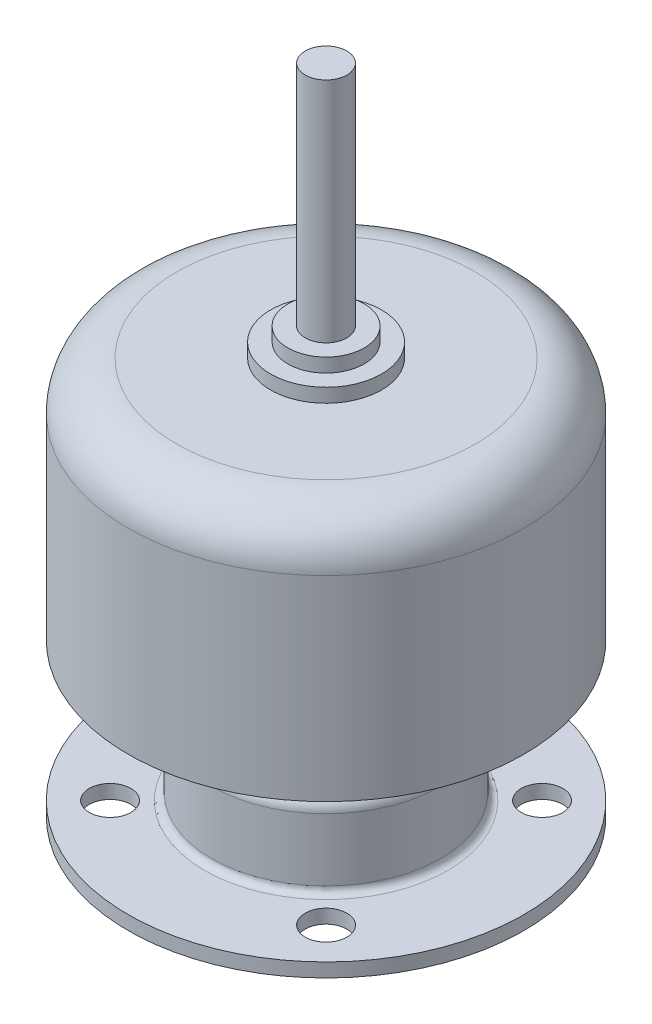
ISO-10303-21;
HEADER;
FILE_DESCRIPTION(('STEP AP214'),'2;1');
FILE_NAME('part.step','',(''),(''),'','','');
FILE_SCHEMA(('AUTOMOTIVE_DESIGN { 1 0 10303 214 1 1 1 1 }'));
ENDSEC;
DATA;
#1=APPLICATION_CONTEXT('core data for automotive mechanical design processes');
#2=APPLICATION_PROTOCOL_DEFINITION('international standard','automotive_design',2000,#1);
#3=PRODUCT_CONTEXT('',#1,'mechanical');
#4=PRODUCT('Part','Part','',(#3));
#5=PRODUCT_RELATED_PRODUCT_CATEGORY('part','',(#4));
#6=PRODUCT_DEFINITION_FORMATION('','',#4);
#7=PRODUCT_DEFINITION_CONTEXT('part definition',#1,'design');
#8=PRODUCT_DEFINITION('design','',#6,#7);
#9=PRODUCT_DEFINITION_SHAPE('','',#8);
#10=(LENGTH_UNIT() NAMED_UNIT(*) SI_UNIT(.MILLI.,.METRE.));
#11=(NAMED_UNIT(*) PLANE_ANGLE_UNIT() SI_UNIT($,.RADIAN.));
#12=(NAMED_UNIT(*) SI_UNIT($,.STERADIAN.) SOLID_ANGLE_UNIT());
#13=UNCERTAINTY_MEASURE_WITH_UNIT(LENGTH_MEASURE(1.E-05),#10,'distance_accuracy_value','');
#14=(GEOMETRIC_REPRESENTATION_CONTEXT(3) GLOBAL_UNCERTAINTY_ASSIGNED_CONTEXT((#13)) GLOBAL_UNIT_ASSIGNED_CONTEXT((#10,
#11,#12)) REPRESENTATION_CONTEXT('',''));
#15=CARTESIAN_POINT('',(0.,0.,0.));
#16=DIRECTION('',(0.,0.,1.));
#17=DIRECTION('',(1.,0.,0.));
#18=AXIS2_PLACEMENT_3D('',#15,#16,#17);
#19=CARTESIAN_POINT('',(0.,28.6,0.));
#20=DIRECTION('',(0.,-1.,0.));
#21=DIRECTION('',(0.,0.,-1.));
#22=AXIS2_PLACEMENT_3D('',#19,#20,#21);
#23=PLANE('',#22);
#24=CARTESIAN_POINT('',(0.,28.6,0.));
#25=DIRECTION('',(0.,-1.,0.));
#26=DIRECTION('',(0.,0.,-1.));
#27=AXIS2_PLACEMENT_3D('',#24,#25,#26);
#28=CIRCLE('',#27,10.75);
#29=CARTESIAN_POINT('',(0.,28.6,-10.75));
#30=VERTEX_POINT('',#29);
#31=EDGE_CURVE('E64',#30,#30,#28,.F.);
#32=ORIENTED_EDGE('',*,*,#31,.T.);
#33=EDGE_LOOP('',(#32));
#34=FACE_BOUND('',#33,.T.);
#35=CARTESIAN_POINT('',(0.,28.6,0.));
#36=DIRECTION('',(0.,-1.,0.));
#37=DIRECTION('',(0.,0.,-1.));
#38=AXIS2_PLACEMENT_3D('',#35,#36,#37);
#39=CIRCLE('',#38,4.);
#40=CARTESIAN_POINT('',(0.,28.6,-4.));
#41=VERTEX_POINT('',#40);
#42=EDGE_CURVE('E84',#41,#41,#39,.T.);
#43=ORIENTED_EDGE('',*,*,#42,.T.);
#44=EDGE_LOOP('',(#43));
#45=FACE_BOUND('',#44,.T.);
#46=ADVANCED_FACE('F44',(#34,#45),#23,.F.);
#47=CARTESIAN_POINT('',(0.,0.,0.));
#48=DIRECTION('',(0.,-1.,0.));
#49=DIRECTION('',(0.,0.,-1.));
#50=AXIS2_PLACEMENT_3D('',#47,#48,#49);
#51=CYLINDRICAL_SURFACE('',#50,4.);
#52=ORIENTED_EDGE('',*,*,#42,.F.);
#53=EDGE_LOOP('',(#52));
#54=FACE_BOUND('',#53,.T.);
#55=CARTESIAN_POINT('',(0.,29.6,0.));
#56=DIRECTION('',(0.,-1.,0.));
#57=DIRECTION('',(0.,0.,-1.));
#58=AXIS2_PLACEMENT_3D('',#55,#56,#57);
#59=CIRCLE('',#58,4.);
#60=CARTESIAN_POINT('',(0.,29.6,-4.));
#61=VERTEX_POINT('',#60);
#62=EDGE_CURVE('E87',#61,#61,#59,.T.);
#63=ORIENTED_EDGE('',*,*,#62,.T.);
#64=EDGE_LOOP('',(#63));
#65=FACE_BOUND('',#64,.T.);
#66=ADVANCED_FACE('F151',(#54,#65),#51,.T.);
#67=CARTESIAN_POINT('',(0.,29.6,0.));
#68=DIRECTION('',(0.,-1.,0.));
#69=DIRECTION('',(0.,0.,-1.));
#70=AXIS2_PLACEMENT_3D('',#67,#68,#69);
#71=PLANE('',#70);
#72=ORIENTED_EDGE('',*,*,#62,.F.);
#73=EDGE_LOOP('',(#72));
#74=FACE_BOUND('',#73,.T.);
#75=CARTESIAN_POINT('',(0.,29.6,0.));
#76=DIRECTION('',(0.,-1.,0.));
#77=DIRECTION('',(0.,0.,-1.));
#78=AXIS2_PLACEMENT_3D('',#75,#76,#77);
#79=CIRCLE('',#78,2.75);
#80=CARTESIAN_POINT('',(0.,29.6,-2.75));
#81=VERTEX_POINT('',#80);
#82=EDGE_CURVE('E90',#81,#81,#79,.T.);
#83=ORIENTED_EDGE('',*,*,#82,.T.);
#84=EDGE_LOOP('',(#83));
#85=FACE_BOUND('',#84,.T.);
#86=ADVANCED_FACE('F157',(#74,#85),#71,.F.);
#87=CARTESIAN_POINT('',(0.,0.,0.));
#88=DIRECTION('',(0.,-1.,0.));
#89=DIRECTION('',(0.,0.,-1.));
#90=AXIS2_PLACEMENT_3D('',#87,#88,#89);
#91=CYLINDRICAL_SURFACE('',#90,2.75);
#92=CARTESIAN_POINT('',(0.,30.6,0.));
#93=DIRECTION('',(0.,-1.,0.));
#94=DIRECTION('',(0.,0.,-1.));
#95=AXIS2_PLACEMENT_3D('',#92,#93,#94);
#96=CIRCLE('',#95,2.75);
#97=CARTESIAN_POINT('',(0.,30.6,-2.75));
#98=VERTEX_POINT('',#97);
#99=EDGE_CURVE('E93',#98,#98,#96,.T.);
#100=ORIENTED_EDGE('',*,*,#99,.T.);
#101=EDGE_LOOP('',(#100));
#102=FACE_BOUND('',#101,.T.);
#103=ORIENTED_EDGE('',*,*,#82,.F.);
#104=EDGE_LOOP('',(#103));
#105=FACE_BOUND('',#104,.T.);
#106=ADVANCED_FACE('F298',(#102,#105),#91,.T.);
#107=CARTESIAN_POINT('',(0.,30.6,0.));
#108=DIRECTION('',(0.,1.,0.));
#109=DIRECTION('',(0.,0.,1.));
#110=AXIS2_PLACEMENT_3D('',#107,#108,#109);
#111=PLANE('',#110);
#112=CARTESIAN_POINT('',(0.,30.6,0.));
#113=DIRECTION('',(0.,-1.,0.));
#114=DIRECTION('',(0.,0.,-1.));
#115=AXIS2_PLACEMENT_3D('',#112,#113,#114);
#116=CIRCLE('',#115,1.5);
#117=CARTESIAN_POINT('',(0.,30.6,-1.5));
#118=VERTEX_POINT('',#117);
#119=EDGE_CURVE('E96',#118,#118,#116,.T.);
#120=ORIENTED_EDGE('',*,*,#119,.T.);
#121=EDGE_LOOP('',(#120));
#122=FACE_BOUND('',#121,.T.);
#123=ORIENTED_EDGE('',*,*,#99,.F.);
#124=EDGE_LOOP('',(#123));
#125=FACE_BOUND('',#124,.T.);
#126=ADVANCED_FACE('F289',(#122,#125),#111,.T.);
#127=CARTESIAN_POINT('',(0.,0.,0.));
#128=DIRECTION('',(0.,-1.,0.));
#129=DIRECTION('',(0.,0.,-1.));
#130=AXIS2_PLACEMENT_3D('',#127,#128,#129);
#131=CYLINDRICAL_SURFACE('',#130,1.5);
#132=CARTESIAN_POINT('',(0.,47.,0.));
#133=DIRECTION('',(0.,-1.,0.));
#134=DIRECTION('',(0.,0.,-1.));
#135=AXIS2_PLACEMENT_3D('',#132,#133,#134);
#136=CIRCLE('',#135,1.5);
#137=CARTESIAN_POINT('',(0.,47.,-1.5));
#138=VERTEX_POINT('',#137);
#139=EDGE_CURVE('E99',#138,#138,#136,.T.);
#140=ORIENTED_EDGE('',*,*,#139,.T.);
#141=EDGE_LOOP('',(#140));
#142=FACE_BOUND('',#141,.T.);
#143=ORIENTED_EDGE('',*,*,#119,.F.);
#144=EDGE_LOOP('',(#143));
#145=FACE_BOUND('',#144,.T.);
#146=ADVANCED_FACE('F280',(#142,#145),#131,.T.);
#147=CARTESIAN_POINT('',(0.,47.,0.));
#148=DIRECTION('',(0.,1.,0.));
#149=DIRECTION('',(0.,0.,1.));
#150=AXIS2_PLACEMENT_3D('',#147,#148,#149);
#151=PLANE('',#150);
#152=ORIENTED_EDGE('',*,*,#139,.F.);
#153=EDGE_LOOP('',(#152));
#154=FACE_BOUND('',#153,.T.);
#155=ADVANCED_FACE('F134',(#154),#151,.T.);
#156=CARTESIAN_POINT('',(0.,0.,0.));
#157=DIRECTION('',(0.,-1.,0.));
#158=DIRECTION('',(0.,0.,-1.));
#159=AXIS2_PLACEMENT_3D('',#156,#157,#158);
#160=PLANE('',#159);
#161=CARTESIAN_POINT('',(7.77817459305201,0.,7.77817459305204));
#162=DIRECTION('',(0.,-1.,0.));
#163=DIRECTION('',(0.,0.,-1.));
#164=AXIS2_PLACEMENT_3D('',#161,#162,#163);
#165=CIRCLE('',#164,1.5);
#166=CARTESIAN_POINT('',(7.77817459305201,0.,6.27817459305204));
#167=VERTEX_POINT('',#166);
#168=EDGE_CURVE('E119',#167,#167,#165,.T.);
#169=ORIENTED_EDGE('',*,*,#168,.F.);
#170=EDGE_LOOP('',(#169));
#171=FACE_BOUND('',#170,.T.);
#172=CARTESIAN_POINT('',(-7.77817459305201,0.,-7.77817459305198));
#173=DIRECTION('',(0.,-1.,0.));
#174=DIRECTION('',(0.,0.,-1.));
#175=AXIS2_PLACEMENT_3D('',#172,#173,#174);
#176=CIRCLE('',#175,1.50000000000005);
#177=CARTESIAN_POINT('',(-7.77817459305201,0.,-9.27817459305203));
#178=VERTEX_POINT('',#177);
#179=EDGE_CURVE('E122',#178,#178,#176,.T.);
#180=ORIENTED_EDGE('',*,*,#179,.F.);
#181=EDGE_LOOP('',(#180));
#182=FACE_BOUND('',#181,.T.);
#183=CARTESIAN_POINT('',(-7.77817459305201,0.,7.77817459305203));
#184=DIRECTION('',(0.,-1.,0.));
#185=DIRECTION('',(0.,0.,-1.));
#186=AXIS2_PLACEMENT_3D('',#183,#184,#185);
#187=CIRCLE('',#186,1.50000000000004);
#188=CARTESIAN_POINT('',(-7.77817459305201,0.,6.278174593052));
#189=VERTEX_POINT('',#188);
#190=EDGE_CURVE('E118',#189,#189,#187,.T.);
#191=ORIENTED_EDGE('',*,*,#190,.F.);
#192=EDGE_LOOP('',(#191));
#193=FACE_BOUND('',#192,.T.);
#194=CARTESIAN_POINT('',(7.77817459305201,0.,-7.77817459305198));
#195=DIRECTION('',(0.,-1.,0.));
#196=DIRECTION('',(0.,0.,-1.));
#197=AXIS2_PLACEMENT_3D('',#194,#195,#196);
#198=CIRCLE('',#197,1.50000000000005);
#199=CARTESIAN_POINT('',(7.77817459305201,0.,-9.27817459305203));
#200=VERTEX_POINT('',#199);
#201=EDGE_CURVE('E78',#200,#200,#198,.T.);
#202=ORIENTED_EDGE('',*,*,#201,.F.);
#203=EDGE_LOOP('',(#202));
#204=FACE_BOUND('',#203,.T.);
#205=CARTESIAN_POINT('',(0.,0.,0.));
#206=DIRECTION('',(0.,-1.,0.));
#207=DIRECTION('',(0.,0.,-1.));
#208=AXIS2_PLACEMENT_3D('',#205,#206,#207);
#209=CIRCLE('',#208,14.25);
#210=CARTESIAN_POINT('',(0.,0.,-14.25));
#211=VERTEX_POINT('',#210);
#212=EDGE_CURVE('E102',#211,#211,#209,.T.);
#213=ORIENTED_EDGE('',*,*,#212,.T.);
#214=EDGE_LOOP('',(#213));
#215=FACE_BOUND('',#214,.T.);
#216=ADVANCED_FACE('F130',(#171,#182,#193,#204,#215),#160,.T.);
#217=CARTESIAN_POINT('',(0.,0.,0.));
#218=DIRECTION('',(0.,-1.,0.));
#219=DIRECTION('',(0.,0.,-1.));
#220=AXIS2_PLACEMENT_3D('',#217,#218,#219);
#221=CYLINDRICAL_SURFACE('',#220,14.25);
#222=CARTESIAN_POINT('',(0.,1.,0.));
#223=DIRECTION('',(0.,-1.,0.));
#224=DIRECTION('',(0.,0.,-1.));
#225=AXIS2_PLACEMENT_3D('',#222,#223,#224);
#226=CIRCLE('',#225,14.25);
#227=CARTESIAN_POINT('',(0.,1.,-14.25));
#228=VERTEX_POINT('',#227);
#229=EDGE_CURVE('E105',#228,#228,#226,.T.);
#230=ORIENTED_EDGE('',*,*,#229,.T.);
#231=EDGE_LOOP('',(#230));
#232=FACE_BOUND('',#231,.T.);
#233=ORIENTED_EDGE('',*,*,#212,.F.);
#234=EDGE_LOOP('',(#233));
#235=FACE_BOUND('',#234,.T.);
#236=ADVANCED_FACE('F133',(#232,#235),#221,.T.);
#237=CARTESIAN_POINT('',(0.,1.,0.));
#238=DIRECTION('',(0.,1.,0.));
#239=DIRECTION('',(0.,0.,1.));
#240=AXIS2_PLACEMENT_3D('',#237,#238,#239);
#241=PLANE('',#240);
#242=CARTESIAN_POINT('',(0.,1.,0.));
#243=DIRECTION('',(0.,1.,0.));
#244=DIRECTION('',(0.,0.,1.));
#245=AXIS2_PLACEMENT_3D('',#242,#243,#244);
#246=CIRCLE('',#245,8.75);
#247=CARTESIAN_POINT('',(0.,1.,8.75));
#248=VERTEX_POINT('',#247);
#249=EDGE_CURVE('E51',#248,#248,#246,.F.);
#250=ORIENTED_EDGE('',*,*,#249,.T.);
#251=EDGE_LOOP('',(#250));
#252=FACE_BOUND('',#251,.T.);
#253=CARTESIAN_POINT('',(7.77817459305201,0.999999999999999,7.77817459305204));
#254=DIRECTION('',(0.,1.,0.));
#255=DIRECTION('',(0.,0.,1.));
#256=AXIS2_PLACEMENT_3D('',#253,#254,#255);
#257=CIRCLE('',#256,1.5);
#258=CARTESIAN_POINT('',(7.77817459305201,0.999999999999999,9.27817459305203));
#259=VERTEX_POINT('',#258);
#260=EDGE_CURVE('E65',#259,#259,#257,.T.);
#261=ORIENTED_EDGE('',*,*,#260,.F.);
#262=EDGE_LOOP('',(#261));
#263=FACE_BOUND('',#262,.T.);
#264=CARTESIAN_POINT('',(-7.77817459305201,0.999999999999999,-7.77817459305198));
#265=DIRECTION('',(0.,1.,0.));
#266=DIRECTION('',(0.,0.,1.));
#267=AXIS2_PLACEMENT_3D('',#264,#265,#266);
#268=CIRCLE('',#267,1.50000000000005);
#269=CARTESIAN_POINT('',(-7.77817459305201,0.999999999999999,-6.27817459305193));
#270=VERTEX_POINT('',#269);
#271=EDGE_CURVE('E69',#270,#270,#268,.T.);
#272=ORIENTED_EDGE('',*,*,#271,.F.);
#273=EDGE_LOOP('',(#272));
#274=FACE_BOUND('',#273,.T.);
#275=CARTESIAN_POINT('',(-7.77817459305201,0.999999999999999,7.77817459305203));
#276=DIRECTION('',(0.,1.,0.));
#277=DIRECTION('',(0.,0.,1.));
#278=AXIS2_PLACEMENT_3D('',#275,#276,#277);
#279=CIRCLE('',#278,1.50000000000004);
#280=CARTESIAN_POINT('',(-7.77817459305201,0.999999999999999,9.27817459305207));
#281=VERTEX_POINT('',#280);
#282=EDGE_CURVE('E72',#281,#281,#279,.T.);
#283=ORIENTED_EDGE('',*,*,#282,.F.);
#284=EDGE_LOOP('',(#283));
#285=FACE_BOUND('',#284,.T.);
#286=CARTESIAN_POINT('',(7.77817459305201,0.999999999999999,-7.77817459305198));
#287=DIRECTION('',(0.,1.,0.));
#288=DIRECTION('',(0.,0.,1.));
#289=AXIS2_PLACEMENT_3D('',#286,#287,#288);
#290=CIRCLE('',#289,1.50000000000005);
#291=CARTESIAN_POINT('',(7.77817459305201,0.999999999999999,-6.27817459305193));
#292=VERTEX_POINT('',#291);
#293=EDGE_CURVE('E75',#292,#292,#290,.T.);
#294=ORIENTED_EDGE('',*,*,#293,.F.);
#295=EDGE_LOOP('',(#294));
#296=FACE_BOUND('',#295,.T.);
#297=ORIENTED_EDGE('',*,*,#229,.F.);
#298=EDGE_LOOP('',(#297));
#299=FACE_BOUND('',#298,.T.);
#300=ADVANCED_FACE('F142',(#252,#263,#274,#285,#296,#299),#241,.T.);
#301=CARTESIAN_POINT('',(0.,0.,0.));
#302=DIRECTION('',(0.,-1.,0.));
#303=DIRECTION('',(0.,0.,-1.));
#304=AXIS2_PLACEMENT_3D('',#301,#302,#303);
#305=CYLINDRICAL_SURFACE('',#304,8.25);
#306=CARTESIAN_POINT('',(0.,1.5,0.));
#307=DIRECTION('',(0.,1.,0.));
#308=DIRECTION('',(0.,0.,1.));
#309=AXIS2_PLACEMENT_3D('',#306,#307,#308);
#310=CIRCLE('',#309,8.25);
#311=CARTESIAN_POINT('',(0.,1.5,8.25));
#312=VERTEX_POINT('',#311);
#313=EDGE_CURVE('E11',#312,#312,#310,.T.);
#314=ORIENTED_EDGE('',*,*,#313,.T.);
#315=EDGE_LOOP('',(#314));
#316=FACE_BOUND('',#315,.T.);
#317=CARTESIAN_POINT('',(0.,6.,0.));
#318=DIRECTION('',(0.,1.,0.));
#319=DIRECTION('',(0.,0.,1.));
#320=AXIS2_PLACEMENT_3D('',#317,#318,#319);
#321=CIRCLE('',#320,8.25);
#322=CARTESIAN_POINT('',(0.,6.,8.25));
#323=VERTEX_POINT('',#322);
#324=EDGE_CURVE('E59',#323,#323,#321,.F.);
#325=ORIENTED_EDGE('',*,*,#324,.T.);
#326=EDGE_LOOP('',(#325));
#327=FACE_BOUND('',#326,.T.);
#328=ADVANCED_FACE('F148',(#316,#327),#305,.T.);
#329=CARTESIAN_POINT('',(0.,7.,0.));
#330=DIRECTION('',(0.,1.,0.));
#331=DIRECTION('',(0.,0.,1.));
#332=AXIS2_PLACEMENT_3D('',#329,#330,#331);
#333=PLANE('',#332);
#334=CARTESIAN_POINT('',(0.,7.,0.));
#335=DIRECTION('',(0.,1.,0.));
#336=DIRECTION('',(0.,0.,1.));
#337=AXIS2_PLACEMENT_3D('',#334,#335,#336);
#338=CIRCLE('',#337,7.25);
#339=CARTESIAN_POINT('',(0.,7.,7.25));
#340=VERTEX_POINT('',#339);
#341=EDGE_CURVE('E55',#340,#340,#338,.T.);
#342=ORIENTED_EDGE('',*,*,#341,.T.);
#343=EDGE_LOOP('',(#342));
#344=FACE_BOUND('',#343,.T.);
#345=CARTESIAN_POINT('',(0.,7.,0.));
#346=DIRECTION('',(0.,-1.,0.));
#347=DIRECTION('',(0.,0.,-1.));
#348=AXIS2_PLACEMENT_3D('',#345,#346,#347);
#349=CIRCLE('',#348,6.5);
#350=CARTESIAN_POINT('',(0.,7.,-6.5));
#351=VERTEX_POINT('',#350);
#352=EDGE_CURVE('E108',#351,#351,#349,.T.);
#353=ORIENTED_EDGE('',*,*,#352,.T.);
#354=EDGE_LOOP('',(#353));
#355=FACE_BOUND('',#354,.T.);
#356=ADVANCED_FACE('F185',(#344,#355),#333,.T.);
#357=CARTESIAN_POINT('',(0.,0.,0.));
#358=DIRECTION('',(0.,-1.,0.));
#359=DIRECTION('',(0.,0.,-1.));
#360=AXIS2_PLACEMENT_3D('',#357,#358,#359);
#361=CYLINDRICAL_SURFACE('',#360,6.5);
#362=CARTESIAN_POINT('',(0.,11.,0.));
#363=DIRECTION('',(0.,-1.,0.));
#364=DIRECTION('',(0.,0.,-1.));
#365=AXIS2_PLACEMENT_3D('',#362,#363,#364);
#366=CIRCLE('',#365,6.5);
#367=CARTESIAN_POINT('',(0.,11.,-6.5));
#368=VERTEX_POINT('',#367);
#369=EDGE_CURVE('E111',#368,#368,#366,.T.);
#370=ORIENTED_EDGE('',*,*,#369,.T.);
#371=EDGE_LOOP('',(#370));
#372=FACE_BOUND('',#371,.T.);
#373=ORIENTED_EDGE('',*,*,#352,.F.);
#374=EDGE_LOOP('',(#373));
#375=FACE_BOUND('',#374,.T.);
#376=ADVANCED_FACE('F190',(#372,#375),#361,.T.);
#377=CARTESIAN_POINT('',(0.,11.,0.));
#378=DIRECTION('',(0.,-1.,0.));
#379=DIRECTION('',(0.,0.,-1.));
#380=AXIS2_PLACEMENT_3D('',#377,#378,#379);
#381=PLANE('',#380);
#382=CARTESIAN_POINT('',(0.,11.,0.));
#383=DIRECTION('',(0.,-1.,0.));
#384=DIRECTION('',(0.,0.,-1.));
#385=AXIS2_PLACEMENT_3D('',#382,#383,#384);
#386=CIRCLE('',#385,14.25);
#387=CARTESIAN_POINT('',(0.,11.,-14.25));
#388=VERTEX_POINT('',#387);
#389=EDGE_CURVE('E68',#388,#388,#386,.T.);
#390=ORIENTED_EDGE('',*,*,#389,.T.);
#391=EDGE_LOOP('',(#390));
#392=FACE_BOUND('',#391,.T.);
#393=ORIENTED_EDGE('',*,*,#369,.F.);
#394=EDGE_LOOP('',(#393));
#395=FACE_BOUND('',#394,.T.);
#396=ADVANCED_FACE('F196',(#392,#395),#381,.T.);
#397=CARTESIAN_POINT('',(0.,0.,0.));
#398=DIRECTION('',(0.,-1.,0.));
#399=DIRECTION('',(0.,0.,-1.));
#400=AXIS2_PLACEMENT_3D('',#397,#398,#399);
#401=CYLINDRICAL_SURFACE('',#400,14.25);
#402=CARTESIAN_POINT('',(0.,25.1,0.));
#403=DIRECTION('',(0.,-1.,0.));
#404=DIRECTION('',(0.,0.,-1.));
#405=AXIS2_PLACEMENT_3D('',#402,#403,#404);
#406=CIRCLE('',#405,14.25);
#407=CARTESIAN_POINT('',(0.,25.1,-14.25));
#408=VERTEX_POINT('',#407);
#409=EDGE_CURVE('E81',#408,#408,#406,.T.);
#410=ORIENTED_EDGE('',*,*,#409,.T.);
#411=EDGE_LOOP('',(#410));
#412=FACE_BOUND('',#411,.T.);
#413=ORIENTED_EDGE('',*,*,#389,.F.);
#414=EDGE_LOOP('',(#413));
#415=FACE_BOUND('',#414,.T.);
#416=ADVANCED_FACE('F166',(#412,#415),#401,.T.);
#417=CARTESIAN_POINT('',(0.,25.1,0.));
#418=DIRECTION('',(0.,-1.,0.));
#419=DIRECTION('',(0.,0.,-1.));
#420=AXIS2_PLACEMENT_3D('',#417,#418,#419);
#421=TOROIDAL_SURFACE('',#420,10.75,3.5);
#422=ORIENTED_EDGE('',*,*,#31,.F.);
#423=EDGE_LOOP('',(#422));
#424=FACE_BOUND('',#423,.T.);
#425=ORIENTED_EDGE('',*,*,#409,.F.);
#426=EDGE_LOOP('',(#425));
#427=FACE_BOUND('',#426,.T.);
#428=ADVANCED_FACE('F163',(#424,#427),#421,.T.);
#429=CARTESIAN_POINT('',(7.77817459305201,10.,-7.77817459305198));
#430=DIRECTION('',(0.,-1.,0.));
#431=DIRECTION('',(0.,0.,-1.));
#432=AXIS2_PLACEMENT_3D('',#429,#430,#431);
#433=CYLINDRICAL_SURFACE('',#432,1.50000000000005);
#434=ORIENTED_EDGE('',*,*,#293,.T.);
#435=EDGE_LOOP('',(#434));
#436=FACE_BOUND('',#435,.T.);
#437=ORIENTED_EDGE('',*,*,#201,.T.);
#438=EDGE_LOOP('',(#437));
#439=FACE_BOUND('',#438,.T.);
#440=ADVANCED_FACE('F165',(#436,#439),#433,.F.);
#441=CARTESIAN_POINT('',(-7.77817459305201,10.,7.77817459305203));
#442=DIRECTION('',(0.,-1.,0.));
#443=DIRECTION('',(0.,0.,-1.));
#444=AXIS2_PLACEMENT_3D('',#441,#442,#443);
#445=CYLINDRICAL_SURFACE('',#444,1.50000000000004);
#446=ORIENTED_EDGE('',*,*,#282,.T.);
#447=EDGE_LOOP('',(#446));
#448=FACE_BOUND('',#447,.T.);
#449=ORIENTED_EDGE('',*,*,#190,.T.);
#450=EDGE_LOOP('',(#449));
#451=FACE_BOUND('',#450,.T.);
#452=ADVANCED_FACE('F128',(#448,#451),#445,.F.);
#453=CARTESIAN_POINT('',(-7.77817459305201,10.,-7.77817459305198));
#454=DIRECTION('',(0.,-1.,0.));
#455=DIRECTION('',(0.,0.,-1.));
#456=AXIS2_PLACEMENT_3D('',#453,#454,#455);
#457=CYLINDRICAL_SURFACE('',#456,1.50000000000005);
#458=ORIENTED_EDGE('',*,*,#271,.T.);
#459=EDGE_LOOP('',(#458));
#460=FACE_BOUND('',#459,.T.);
#461=ORIENTED_EDGE('',*,*,#179,.T.);
#462=EDGE_LOOP('',(#461));
#463=FACE_BOUND('',#462,.T.);
#464=ADVANCED_FACE('F177',(#460,#463),#457,.F.);
#465=CARTESIAN_POINT('',(7.77817459305201,10.,7.77817459305204));
#466=DIRECTION('',(0.,-1.,0.));
#467=DIRECTION('',(0.,0.,-1.));
#468=AXIS2_PLACEMENT_3D('',#465,#466,#467);
#469=CYLINDRICAL_SURFACE('',#468,1.5);
#470=ORIENTED_EDGE('',*,*,#260,.T.);
#471=EDGE_LOOP('',(#470));
#472=FACE_BOUND('',#471,.T.);
#473=ORIENTED_EDGE('',*,*,#168,.T.);
#474=EDGE_LOOP('',(#473));
#475=FACE_BOUND('',#474,.T.);
#476=ADVANCED_FACE('F170',(#472,#475),#469,.F.);
#477=CARTESIAN_POINT('',(0.,6.,0.));
#478=DIRECTION('',(0.,1.,0.));
#479=DIRECTION('',(0.,0.,1.));
#480=AXIS2_PLACEMENT_3D('',#477,#478,#479);
#481=TOROIDAL_SURFACE('',#480,7.25,1.);
#482=ORIENTED_EDGE('',*,*,#341,.F.);
#483=EDGE_LOOP('',(#482));
#484=FACE_BOUND('',#483,.T.);
#485=ORIENTED_EDGE('',*,*,#324,.F.);
#486=EDGE_LOOP('',(#485));
#487=FACE_BOUND('',#486,.T.);
#488=ADVANCED_FACE('F168',(#484,#487),#481,.T.);
#489=CARTESIAN_POINT('',(0.,1.5,0.));
#490=DIRECTION('',(0.,1.,0.));
#491=DIRECTION('',(0.,0.,1.));
#492=AXIS2_PLACEMENT_3D('',#489,#490,#491);
#493=TOROIDAL_SURFACE('',#492,8.75,0.5);
#494=ORIENTED_EDGE('',*,*,#313,.F.);
#495=EDGE_LOOP('',(#494));
#496=FACE_BOUND('',#495,.T.);
#497=ORIENTED_EDGE('',*,*,#249,.F.);
#498=EDGE_LOOP('',(#497));
#499=FACE_BOUND('',#498,.T.);
#500=ADVANCED_FACE('F46',(#496,#499),#493,.F.);
#501=CLOSED_SHELL('',(#46,#66,#86,#106,#126,#146,#155,#216,#236,#300,#328,#356,#376,#396,#416,
#428,#440,#452,#464,#476,#488,#500));
#502=MANIFOLD_SOLID_BREP('B2',#501);
#503=ADVANCED_BREP_SHAPE_REPRESENTATION('',(#18,#502),#14);
#504=SHAPE_DEFINITION_REPRESENTATION(#9,#503);
ENDSEC;
END-ISO-10303-21;
